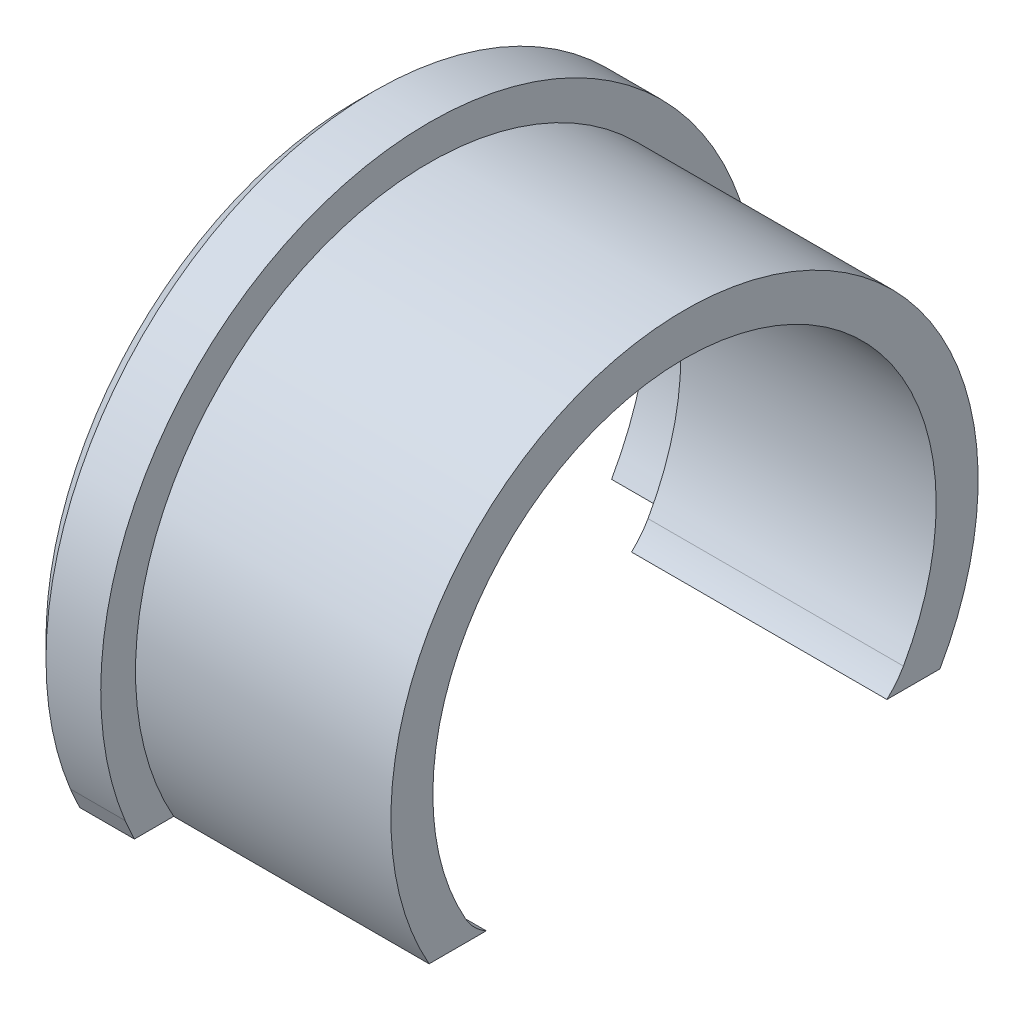
ISO-10303-21;
HEADER;
FILE_DESCRIPTION(('STEP AP214'),'2;1');
FILE_NAME('part.step','',(''),(''),'','','');
FILE_SCHEMA(('AUTOMOTIVE_DESIGN { 1 0 10303 214 1 1 1 1 }'));
ENDSEC;
DATA;
#1=APPLICATION_CONTEXT('core data for automotive mechanical design processes');
#2=APPLICATION_PROTOCOL_DEFINITION('international standard','automotive_design',2000,#1);
#3=PRODUCT_CONTEXT('',#1,'mechanical');
#4=PRODUCT('Part','Part','',(#3));
#5=PRODUCT_RELATED_PRODUCT_CATEGORY('part','',(#4));
#6=PRODUCT_DEFINITION_FORMATION('','',#4);
#7=PRODUCT_DEFINITION_CONTEXT('part definition',#1,'design');
#8=PRODUCT_DEFINITION('design','',#6,#7);
#9=PRODUCT_DEFINITION_SHAPE('','',#8);
#10=(LENGTH_UNIT() NAMED_UNIT(*) SI_UNIT(.MILLI.,.METRE.));
#11=(NAMED_UNIT(*) PLANE_ANGLE_UNIT() SI_UNIT($,.RADIAN.));
#12=(NAMED_UNIT(*) SI_UNIT($,.STERADIAN.) SOLID_ANGLE_UNIT());
#13=UNCERTAINTY_MEASURE_WITH_UNIT(LENGTH_MEASURE(1.E-05),#10,'distance_accuracy_value','');
#14=(GEOMETRIC_REPRESENTATION_CONTEXT(3) GLOBAL_UNCERTAINTY_ASSIGNED_CONTEXT((#13)) GLOBAL_UNIT_ASSIGNED_CONTEXT((#10,
#11,#12)) REPRESENTATION_CONTEXT('',''));
#15=CARTESIAN_POINT('',(0.,0.,0.));
#16=DIRECTION('',(0.,0.,1.));
#17=DIRECTION('',(1.,0.,0.));
#18=AXIS2_PLACEMENT_3D('',#15,#16,#17);
#19=CARTESIAN_POINT('',(7.,-0.567071197410996,-0.56707119741101));
#20=DIRECTION('',(0.,1.,0.));
#21=DIRECTION('',(0.,0.,1.));
#22=AXIS2_PLACEMENT_3D('',#19,#20,#21);
#23=PLANE('',#22);
#24=DIRECTION('',(-1.,0.,0.));
#25=VECTOR('',#24,1.);
#26=CARTESIAN_POINT('',(7.,-0.567071197411,1.00000000000001));
#27=LINE('',#26,#25);
#28=CARTESIAN_POINT('',(7.,-0.567071197411,1.00000000000001));
#29=VERTEX_POINT('',#28);
#30=CARTESIAN_POINT('',(0.,-0.567071197411,1.00000000000001));
#31=VERTEX_POINT('',#30);
#32=EDGE_CURVE('E135',#29,#31,#27,.T.);
#33=ORIENTED_EDGE('',*,*,#32,.T.);
#34=DIRECTION('',(0.,0.,1.));
#35=VECTOR('',#34,1.);
#36=CARTESIAN_POINT('',(0.,-0.567071197410996,-0.56707119741101));
#37=LINE('',#36,#35);
#38=CARTESIAN_POINT('',(0.,-0.567071197410996,-0.56707119741101));
#39=VERTEX_POINT('',#38);
#40=EDGE_CURVE('E12',#39,#31,#37,.T.);
#41=ORIENTED_EDGE('',*,*,#40,.F.);
#42=DIRECTION('',(-1.,0.,0.));
#43=VECTOR('',#42,1.);
#44=CARTESIAN_POINT('',(7.,-0.567071197410996,-0.56707119741101));
#45=LINE('',#44,#43);
#46=CARTESIAN_POINT('',(7.,-0.567071197410996,-0.56707119741101));
#47=VERTEX_POINT('',#46);
#48=EDGE_CURVE('E127',#47,#39,#45,.T.);
#49=ORIENTED_EDGE('',*,*,#48,.F.);
#50=DIRECTION('',(0.,0.,-1.));
#51=VECTOR('',#50,1.);
#52=CARTESIAN_POINT('',(7.,-0.567071197410996,-0.56707119741101));
#53=LINE('',#52,#51);
#54=EDGE_CURVE('E59',#29,#47,#53,.T.);
#55=ORIENTED_EDGE('',*,*,#54,.F.);
#56=EDGE_LOOP('',(#33,#41,#49,#55));
#57=FACE_BOUND('',#56,.T.);
#58=ADVANCED_FACE('F49',(#57),#23,.F.);
#59=CARTESIAN_POINT('',(7.,0.742777429013932,-1.30984862642491));
#60=DIRECTION('',(-1.,0.,0.));
#61=DIRECTION('',(0.,0.,1.));
#62=AXIS2_PLACEMENT_3D('',#59,#60,#61);
#63=CYLINDRICAL_SURFACE('',#62,1.50579604634883);
#64=CARTESIAN_POINT('',(0.,0.742777429013932,-1.30984862642491));
#65=DIRECTION('',(-1.,0.,0.));
#66=DIRECTION('',(0.,0.,-1.));
#67=AXIS2_PLACEMENT_3D('',#64,#65,#66);
#68=CIRCLE('',#67,1.50579604634883);
#69=CARTESIAN_POINT('',(0.,0.,0.));
#70=VERTEX_POINT('',#69);
#71=EDGE_CURVE('E124',#39,#70,#68,.T.);
#72=ORIENTED_EDGE('',*,*,#71,.T.);
#73=DIRECTION('',(-1.,0.,0.));
#74=VECTOR('',#73,1.);
#75=CARTESIAN_POINT('',(7.,0.,0.));
#76=LINE('',#75,#74);
#77=CARTESIAN_POINT('',(7.,0.,0.));
#78=VERTEX_POINT('',#77);
#79=EDGE_CURVE('E108',#78,#70,#76,.T.);
#80=ORIENTED_EDGE('',*,*,#79,.F.);
#81=CARTESIAN_POINT('',(7.,0.742777429013932,-1.30984862642491));
#82=DIRECTION('',(-1.,0.,0.));
#83=DIRECTION('',(0.,0.,-1.));
#84=AXIS2_PLACEMENT_3D('',#81,#82,#83);
#85=CIRCLE('',#84,1.50579604634883);
#86=EDGE_CURVE('E114',#47,#78,#85,.T.);
#87=ORIENTED_EDGE('',*,*,#86,.F.);
#88=ORIENTED_EDGE('',*,*,#48,.T.);
#89=EDGE_LOOP('',(#72,#80,#87,#88));
#90=FACE_BOUND('',#89,.T.);
#91=ADVANCED_FACE('F123',(#90),#63,.F.);
#92=CARTESIAN_POINT('',(7.,3.40242718446602,-6.));
#93=DIRECTION('',(-1.,0.,0.));
#94=DIRECTION('',(0.,0.,1.));
#95=AXIS2_PLACEMENT_3D('',#92,#93,#94);
#96=CYLINDRICAL_SURFACE('',#95,6.89757281553398);
#97=CARTESIAN_POINT('',(0.,3.40242718446602,-6.));
#98=DIRECTION('',(-1.,0.,0.));
#99=DIRECTION('',(0.,0.,1.));
#100=AXIS2_PLACEMENT_3D('',#97,#98,#99);
#101=CIRCLE('',#100,6.89757281553398);
#102=CARTESIAN_POINT('',(0.,0.,-12.));
#103=VERTEX_POINT('',#102);
#104=EDGE_CURVE('E53',#70,#103,#101,.T.);
#105=ORIENTED_EDGE('',*,*,#104,.T.);
#106=DIRECTION('',(-1.,0.,0.));
#107=VECTOR('',#106,1.);
#108=CARTESIAN_POINT('',(7.,0.,-12.));
#109=LINE('',#108,#107);
#110=CARTESIAN_POINT('',(7.,0.,-12.));
#111=VERTEX_POINT('',#110);
#112=EDGE_CURVE('E111',#111,#103,#109,.T.);
#113=ORIENTED_EDGE('',*,*,#112,.F.);
#114=CARTESIAN_POINT('',(7.,3.40242718446602,-6.));
#115=DIRECTION('',(-1.,0.,0.));
#116=DIRECTION('',(0.,0.,1.));
#117=AXIS2_PLACEMENT_3D('',#114,#115,#116);
#118=CIRCLE('',#117,6.89757281553398);
#119=EDGE_CURVE('E103',#78,#111,#118,.T.);
#120=ORIENTED_EDGE('',*,*,#119,.F.);
#121=ORIENTED_EDGE('',*,*,#79,.T.);
#122=EDGE_LOOP('',(#105,#113,#120,#121));
#123=FACE_BOUND('',#122,.T.);
#124=ADVANCED_FACE('F106',(#123),#96,.F.);
#125=CARTESIAN_POINT('',(7.,1.14073875175323,-9.98836767418035));
#126=DIRECTION('',(-1.,0.,0.));
#127=DIRECTION('',(0.,0.,1.));
#128=AXIS2_PLACEMENT_3D('',#125,#126,#127);
#129=CYLINDRICAL_SURFACE('',#128,2.3125634075705);
#130=CARTESIAN_POINT('',(0.,1.14073875175323,-9.98836767418035));
#131=DIRECTION('',(-1.,0.,0.));
#132=DIRECTION('',(0.,0.,1.));
#133=AXIS2_PLACEMENT_3D('',#130,#131,#132);
#134=CIRCLE('',#133,2.3125634075705);
#135=CARTESIAN_POINT('',(0.,-0.567071197411006,-11.5476414447446));
#136=VERTEX_POINT('',#135);
#137=EDGE_CURVE('E125',#103,#136,#134,.T.);
#138=ORIENTED_EDGE('',*,*,#137,.T.);
#139=DIRECTION('',(-1.,0.,0.));
#140=VECTOR('',#139,1.);
#141=CARTESIAN_POINT('',(7.,-0.567071197411006,-11.5476414447446));
#142=LINE('',#141,#140);
#143=CARTESIAN_POINT('',(7.,-0.567071197411006,-11.5476414447446));
#144=VERTEX_POINT('',#143);
#145=EDGE_CURVE('E130',#144,#136,#142,.T.);
#146=ORIENTED_EDGE('',*,*,#145,.F.);
#147=CARTESIAN_POINT('',(7.,1.14073875175323,-9.98836767418035));
#148=DIRECTION('',(-1.,0.,0.));
#149=DIRECTION('',(0.,0.,1.));
#150=AXIS2_PLACEMENT_3D('',#147,#148,#149);
#151=CIRCLE('',#150,2.3125634075705);
#152=EDGE_CURVE('E113',#111,#144,#151,.T.);
#153=ORIENTED_EDGE('',*,*,#152,.F.);
#154=ORIENTED_EDGE('',*,*,#112,.T.);
#155=EDGE_LOOP('',(#138,#146,#153,#154));
#156=FACE_BOUND('',#155,.T.);
#157=ADVANCED_FACE('F170',(#156),#129,.F.);
#158=CARTESIAN_POINT('',(7.,3.40242718446602,-6.));
#159=DIRECTION('',(-1.,0.,0.));
#160=DIRECTION('',(0.,0.,1.));
#161=AXIS2_PLACEMENT_3D('',#158,#159,#160);
#162=CYLINDRICAL_SURFACE('',#161,8.04716828478965);
#163=CARTESIAN_POINT('',(0.,3.40242718446602,-6.));
#164=DIRECTION('',(1.,0.,0.));
#165=DIRECTION('',(0.,0.,1.));
#166=AXIS2_PLACEMENT_3D('',#163,#164,#165);
#167=CIRCLE('',#166,8.04716828478965);
#168=CARTESIAN_POINT('',(0.,-0.567071197411007,-13.));
#169=VERTEX_POINT('',#168);
#170=EDGE_CURVE('E82',#169,#31,#167,.T.);
#171=ORIENTED_EDGE('',*,*,#170,.T.);
#172=ORIENTED_EDGE('',*,*,#32,.F.);
#173=CARTESIAN_POINT('',(7.,3.40242718446602,-6.));
#174=DIRECTION('',(1.,0.,0.));
#175=DIRECTION('',(0.,0.,1.));
#176=AXIS2_PLACEMENT_3D('',#173,#174,#175);
#177=CIRCLE('',#176,8.04716828478965);
#178=CARTESIAN_POINT('',(7.,-0.567071197411007,-13.));
#179=VERTEX_POINT('',#178);
#180=EDGE_CURVE('E140',#179,#29,#177,.T.);
#181=ORIENTED_EDGE('',*,*,#180,.F.);
#182=DIRECTION('',(-1.,0.,0.));
#183=VECTOR('',#182,1.);
#184=CARTESIAN_POINT('',(7.,-0.567071197411007,-13.));
#185=LINE('',#184,#183);
#186=EDGE_CURVE('E133',#179,#169,#185,.T.);
#187=ORIENTED_EDGE('',*,*,#186,.T.);
#188=EDGE_LOOP('',(#171,#172,#181,#187));
#189=FACE_BOUND('',#188,.T.);
#190=ADVANCED_FACE('F149',(#189),#162,.T.);
#191=ORIENTED_EDGE('',*,*,#145,.T.);
#192=DIRECTION('',(0.,0.,-1.));
#193=VECTOR('',#192,1.);
#194=CARTESIAN_POINT('',(0.,-0.567071197411007,-11.5476414447446));
#195=LINE('',#194,#193);
#196=EDGE_CURVE('E78',#136,#169,#195,.T.);
#197=ORIENTED_EDGE('',*,*,#196,.T.);
#198=ORIENTED_EDGE('',*,*,#186,.F.);
#199=DIRECTION('',(0.,0.,-1.));
#200=VECTOR('',#199,1.);
#201=CARTESIAN_POINT('',(7.,-0.567071197411007,-11.5476414447446));
#202=LINE('',#201,#200);
#203=EDGE_CURVE('E142',#144,#179,#202,.T.);
#204=ORIENTED_EDGE('',*,*,#203,.F.);
#205=EDGE_LOOP('',(#191,#197,#198,#204));
#206=FACE_BOUND('',#205,.T.);
#207=ADVANCED_FACE('F51',(#206),#23,.F.);
#208=CARTESIAN_POINT('',(7.,0.742777429013932,-1.30984862642491));
#209=DIRECTION('',(1.,0.,0.));
#210=DIRECTION('',(0.,0.,-1.));
#211=AXIS2_PLACEMENT_3D('',#208,#209,#210);
#212=PLANE('',#211);
#213=ORIENTED_EDGE('',*,*,#86,.T.);
#214=ORIENTED_EDGE('',*,*,#119,.T.);
#215=ORIENTED_EDGE('',*,*,#152,.T.);
#216=ORIENTED_EDGE('',*,*,#203,.T.);
#217=ORIENTED_EDGE('',*,*,#180,.T.);
#218=ORIENTED_EDGE('',*,*,#54,.T.);
#219=EDGE_LOOP('',(#213,#214,#215,#216,#217,#218));
#220=FACE_BOUND('',#219,.T.);
#221=ADVANCED_FACE('F117',(#220),#212,.T.);
#222=CARTESIAN_POINT('',(0.,0.742777429013932,-1.30984862642491));
#223=DIRECTION('',(1.,0.,0.));
#224=DIRECTION('',(0.,0.,-1.));
#225=AXIS2_PLACEMENT_3D('',#222,#223,#224);
#226=PLANE('',#225);
#227=ORIENTED_EDGE('',*,*,#71,.F.);
#228=ORIENTED_EDGE('',*,*,#40,.T.);
#229=ORIENTED_EDGE('',*,*,#170,.F.);
#230=ORIENTED_EDGE('',*,*,#196,.F.);
#231=ORIENTED_EDGE('',*,*,#137,.F.);
#232=ORIENTED_EDGE('',*,*,#104,.F.);
#233=EDGE_LOOP('',(#227,#228,#229,#230,#231,#232));
#234=FACE_BOUND('',#233,.T.);
#235=ADVANCED_FACE('F154',(#234),#226,.F.);
#236=CLOSED_SHELL('',(#58,#91,#124,#157,#190,#207,#221,#235));
#237=MANIFOLD_SOLID_BREP('B2',#236);
#238=CARTESIAN_POINT('',(-2.,0.,-14.3320759270668));
#239=DIRECTION('',(0.,0.409795897842805,0.912177242706268));
#240=DIRECTION('',(0.,-0.912177242706268,0.409795897842805));
#241=AXIS2_PLACEMENT_3D('',#238,#239,#240);
#242=PLANE('',#241);
#243=DIRECTION('',(1.,0.,0.));
#244=VECTOR('',#243,1.);
#245=CARTESIAN_POINT('',(-2.,-0.567071197410992,-14.0773190228117));
#246=LINE('',#245,#244);
#247=CARTESIAN_POINT('',(-1.5,-0.567071197410992,-14.0773190228117));
#248=VERTEX_POINT('',#247);
#249=CARTESIAN_POINT('',(0.,-0.567071197410992,-14.0773190228117));
#250=VERTEX_POINT('',#249);
#251=EDGE_CURVE('E350',#248,#250,#246,.T.);
#252=ORIENTED_EDGE('',*,*,#251,.F.);
#253=CARTESIAN_POINT('',(-1.5,-0.567071197410992,-14.0773190228117));
#254=CARTESIAN_POINT('',(-1.50357950128393,-0.472559331175827,-14.1197785068542));
#255=CARTESIAN_POINT('',(-1.50536925192589,-0.378047464940661,-14.1622379908967));
#256=CARTESIAN_POINT('',(-1.50536925192589,-0.18902373247033,-14.2471569589818));
#257=CARTESIAN_POINT('',(-1.50357950128393,-0.0945118662351652,-14.2896164430243));
#258=CARTESIAN_POINT('',(-1.5,0.,-14.3320759270668));
#259=B_SPLINE_CURVE_WITH_KNOTS('',3,(#253,#254,#255,#256,#257,#258),.UNSPECIFIED.,.F.,.F.,(4,2,
4),(0.,0.310880257761639,0.621760515523277),.UNSPECIFIED.);
#260=CARTESIAN_POINT('',(-1.5,0.,-14.3320759270668));
#261=VERTEX_POINT('',#260);
#262=EDGE_CURVE('E47',#248,#261,#259,.T.);
#263=ORIENTED_EDGE('',*,*,#262,.T.);
#264=DIRECTION('',(1.,0.,0.));
#265=VECTOR('',#264,1.);
#266=CARTESIAN_POINT('',(-2.,0.,-14.3320759270668));
#267=LINE('',#266,#265);
#268=CARTESIAN_POINT('',(0.,0.,-14.3320759270668));
#269=VERTEX_POINT('',#268);
#270=EDGE_CURVE('E316',#261,#269,#267,.T.);
#271=ORIENTED_EDGE('',*,*,#270,.T.);
#272=DIRECTION('',(0.,-0.912177242706268,0.409795897842805));
#273=VECTOR('',#272,1.);
#274=CARTESIAN_POINT('',(0.,0.,-14.3320759270668));
#275=LINE('',#274,#273);
#276=EDGE_CURVE('E331',#269,#250,#275,.T.);
#277=ORIENTED_EDGE('',*,*,#276,.T.);
#278=EDGE_LOOP('',(#252,#263,#271,#277));
#279=FACE_BOUND('',#278,.T.);
#280=ADVANCED_FACE('F248',(#279),#242,.F.);
#281=CARTESIAN_POINT('',(-2.,3.40242718446602,-6.));
#282=DIRECTION('',(1.,0.,0.));
#283=DIRECTION('',(0.,0.,-1.));
#284=AXIS2_PLACEMENT_3D('',#281,#282,#283);
#285=CYLINDRICAL_SURFACE('',#284,9.);
#286=ORIENTED_EDGE('',*,*,#270,.F.);
#287=CARTESIAN_POINT('',(-1.5,3.40242718446602,-6.));
#288=DIRECTION('',(1.,0.,0.));
#289=DIRECTION('',(0.,0.,-1.));
#290=AXIS2_PLACEMENT_3D('',#287,#288,#289);
#291=CIRCLE('',#290,9.);
#292=CARTESIAN_POINT('',(-1.5,0.,2.33207592706684));
#293=VERTEX_POINT('',#292);
#294=EDGE_CURVE('E354',#261,#293,#291,.T.);
#295=ORIENTED_EDGE('',*,*,#294,.T.);
#296=DIRECTION('',(1.,0.,0.));
#297=VECTOR('',#296,1.);
#298=CARTESIAN_POINT('',(-2.,0.,2.33207592706684));
#299=LINE('',#298,#297);
#300=CARTESIAN_POINT('',(0.,0.,2.33207592706684));
#301=VERTEX_POINT('',#300);
#302=EDGE_CURVE('E346',#293,#301,#299,.T.);
#303=ORIENTED_EDGE('',*,*,#302,.T.);
#304=CARTESIAN_POINT('',(0.,3.40242718446602,-6.));
#305=DIRECTION('',(1.,0.,0.));
#306=DIRECTION('',(0.,0.,-1.));
#307=AXIS2_PLACEMENT_3D('',#304,#305,#306);
#308=CIRCLE('',#307,9.);
#309=EDGE_CURVE('E342',#269,#301,#308,.T.);
#310=ORIENTED_EDGE('',*,*,#309,.F.);
#311=EDGE_LOOP('',(#286,#295,#303,#310));
#312=FACE_BOUND('',#311,.T.);
#313=ADVANCED_FACE('F375',(#312),#285,.T.);
#314=CARTESIAN_POINT('',(-2.,0.,2.33207592706683));
#315=DIRECTION('',(0.,-0.409795897842802,0.912177242706269));
#316=DIRECTION('',(0.,-0.912177242706269,-0.409795897842802));
#317=AXIS2_PLACEMENT_3D('',#314,#315,#316);
#318=PLANE('',#317);
#319=ORIENTED_EDGE('',*,*,#302,.F.);
#320=CARTESIAN_POINT('',(-1.5,0.,2.33207592706684));
#321=CARTESIAN_POINT('',(-1.50357950128393,-0.0945118662351571,2.28961644302431));
#322=CARTESIAN_POINT('',(-1.50536925192589,-0.189023732470325,2.24715695898179));
#323=CARTESIAN_POINT('',(-1.50536925192589,-0.378047464940661,2.16223799089674));
#324=CARTESIAN_POINT('',(-1.50357950128392,-0.472559331175828,2.11977850685422));
#325=CARTESIAN_POINT('',(-1.5,-0.567071197410996,2.0773190228117));
#326=B_SPLINE_CURVE_WITH_KNOTS('',3,(#320,#321,#322,#323,#324,#325),.UNSPECIFIED.,.F.,.F.,(4,2,
4),(0.,0.310880257761646,0.621760515523291),.UNSPECIFIED.);
#327=CARTESIAN_POINT('',(-1.5,-0.567071197410996,2.0773190228117));
#328=VERTEX_POINT('',#327);
#329=EDGE_CURVE('E357',#293,#328,#326,.T.);
#330=ORIENTED_EDGE('',*,*,#329,.T.);
#331=DIRECTION('',(1.,0.,0.));
#332=VECTOR('',#331,1.);
#333=CARTESIAN_POINT('',(-2.,-0.567071197410996,2.0773190228117));
#334=LINE('',#333,#332);
#335=CARTESIAN_POINT('',(0.,-0.567071197410996,2.0773190228117));
#336=VERTEX_POINT('',#335);
#337=EDGE_CURVE('E348',#328,#336,#334,.T.);
#338=ORIENTED_EDGE('',*,*,#337,.T.);
#339=DIRECTION('',(0.,-0.912177242706269,-0.409795897842802));
#340=VECTOR('',#339,1.);
#341=CARTESIAN_POINT('',(0.,0.,2.33207592706683));
#342=LINE('',#341,#340);
#343=EDGE_CURVE('E339',#301,#336,#342,.T.);
#344=ORIENTED_EDGE('',*,*,#343,.F.);
#345=EDGE_LOOP('',(#319,#330,#338,#344));
#346=FACE_BOUND('',#345,.T.);
#347=ADVANCED_FACE('F370',(#346),#318,.T.);
#348=CARTESIAN_POINT('',(0.,3.40242718446602,-6.));
#349=DIRECTION('',(1.,0.,0.));
#350=DIRECTION('',(0.,0.,-1.));
#351=AXIS2_PLACEMENT_3D('',#348,#349,#350);
#352=PLANE('',#351);
#353=CARTESIAN_POINT('',(0.,3.40242718446602,-6.));
#354=DIRECTION('',(1.,0.,0.));
#355=DIRECTION('',(0.,0.,1.));
#356=AXIS2_PLACEMENT_3D('',#353,#354,#355);
#357=CIRCLE('',#356,8.04716828478965);
#358=CARTESIAN_POINT('',(0.,-0.567071197411007,-13.));
#359=VERTEX_POINT('',#358);
#360=CARTESIAN_POINT('',(0.,-0.567071197411,1.00000000000001));
#361=VERTEX_POINT('',#360);
#362=EDGE_CURVE('E352',#359,#361,#357,.T.);
#363=ORIENTED_EDGE('',*,*,#362,.F.);
#364=DIRECTION('',(0.,0.,-1.));
#365=VECTOR('',#364,1.);
#366=CARTESIAN_POINT('',(0.,-0.567071197410996,2.0773190228117));
#367=LINE('',#366,#365);
#368=EDGE_CURVE('E329',#359,#250,#367,.T.);
#369=ORIENTED_EDGE('',*,*,#368,.T.);
#370=ORIENTED_EDGE('',*,*,#276,.F.);
#371=ORIENTED_EDGE('',*,*,#309,.T.);
#372=ORIENTED_EDGE('',*,*,#343,.T.);
#373=EDGE_CURVE('E336',#336,#361,#367,.T.);
#374=ORIENTED_EDGE('',*,*,#373,.T.);
#375=EDGE_LOOP('',(#363,#369,#370,#371,#372,#374));
#376=FACE_BOUND('',#375,.T.);
#377=ADVANCED_FACE('F374',(#376),#352,.T.);
#378=CARTESIAN_POINT('',(-2.,3.40242718446602,-6.));
#379=DIRECTION('',(1.,0.,0.));
#380=DIRECTION('',(0.,0.,-1.));
#381=AXIS2_PLACEMENT_3D('',#378,#379,#380);
#382=PLANE('',#381);
#383=DIRECTION('',(0.,0.,1.));
#384=VECTOR('',#383,1.);
#385=CARTESIAN_POINT('',(-2.,-0.567071197410992,-14.0773190228117));
#386=LINE('',#385,#384);
#387=CARTESIAN_POINT('',(-2.,-0.56707119741119,0.999999999999899));
#388=VERTEX_POINT('',#387);
#389=CARTESIAN_POINT('',(-2.,-0.567071197411196,1.51618803625043));
#390=VERTEX_POINT('',#389);
#391=EDGE_CURVE('E317',#388,#390,#386,.T.);
#392=ORIENTED_EDGE('',*,*,#391,.T.);
#393=CARTESIAN_POINT('',(-2.,3.40242718446602,-6.));
#394=DIRECTION('',(1.,0.,0.));
#395=DIRECTION('',(0.,0.,-1.));
#396=AXIS2_PLACEMENT_3D('',#393,#394,#395);
#397=CIRCLE('',#396,8.5);
#398=CARTESIAN_POINT('',(-2.,-0.567071197411,-13.5161880362505));
#399=VERTEX_POINT('',#398);
#400=EDGE_CURVE('E276',#390,#399,#397,.F.);
#401=ORIENTED_EDGE('',*,*,#400,.T.);
#402=CARTESIAN_POINT('',(-2.,-0.567071197411007,-13.));
#403=VERTEX_POINT('',#402);
#404=EDGE_CURVE('E310',#399,#403,#386,.T.);
#405=ORIENTED_EDGE('',*,*,#404,.T.);
#406=CARTESIAN_POINT('',(-2.,3.40242718446602,-6.));
#407=DIRECTION('',(-1.,0.,0.));
#408=DIRECTION('',(0.,0.,1.));
#409=AXIS2_PLACEMENT_3D('',#406,#407,#408);
#410=CIRCLE('',#409,8.04716828478965);
#411=EDGE_CURVE('E313',#388,#403,#410,.T.);
#412=ORIENTED_EDGE('',*,*,#411,.F.);
#413=EDGE_LOOP('',(#392,#401,#405,#412));
#414=FACE_BOUND('',#413,.T.);
#415=ADVANCED_FACE('F312',(#414),#382,.F.);
#416=CARTESIAN_POINT('',(7.,-0.567071197410996,-0.56707119741101));
#417=DIRECTION('',(0.,1.,0.));
#418=DIRECTION('',(0.,0.,1.));
#419=AXIS2_PLACEMENT_3D('',#416,#417,#418);
#420=PLANE('',#419);
#421=ORIENTED_EDGE('',*,*,#404,.F.);
#422=CARTESIAN_POINT('',(-2.,-0.567071197411,-13.5161880362505));
#423=CARTESIAN_POINT('',(-1.91701102768158,-0.567071197410998,-13.6100167290758));
#424=CARTESIAN_POINT('',(-1.83384987080323,-0.567071197410997,-13.7036919955496));
#425=CARTESIAN_POINT('',(-1.66718320406985,-0.567071197410995,-13.8907356576772));
#426=CARTESIAN_POINT('',(-1.58367769428153,-0.567071197410995,-13.9841040533905));
#427=CARTESIAN_POINT('',(-1.5,-0.567071197410996,-14.0773190228117));
#428=B_SPLINE_CURVE_WITH_KNOTS('',3,(#422,#423,#424,#425,#426,#427),.UNSPECIFIED.,.F.,.F.,(4,2,
4),(0.,0.375789172356596,0.751578271916111),.UNSPECIFIED.);
#429=EDGE_CURVE('E262',#399,#248,#428,.T.);
#430=ORIENTED_EDGE('',*,*,#429,.T.);
#431=ORIENTED_EDGE('',*,*,#251,.T.);
#432=ORIENTED_EDGE('',*,*,#368,.F.);
#433=DIRECTION('',(1.,0.,0.));
#434=VECTOR('',#433,1.);
#435=CARTESIAN_POINT('',(-2.,-0.567071197411007,-13.));
#436=LINE('',#435,#434);
#437=EDGE_CURVE('E321',#403,#359,#436,.T.);
#438=ORIENTED_EDGE('',*,*,#437,.F.);
#439=EDGE_LOOP('',(#421,#430,#431,#432,#438));
#440=FACE_BOUND('',#439,.T.);
#441=ADVANCED_FACE('F327',(#440),#420,.F.);
#442=ORIENTED_EDGE('',*,*,#337,.F.);
#443=CARTESIAN_POINT('',(-1.5,-0.567071197410996,2.0773190228117));
#444=CARTESIAN_POINT('',(-1.58367769428154,-0.567071197410996,1.98410405339046));
#445=CARTESIAN_POINT('',(-1.66718320406987,-0.567071197410996,1.89073565767715));
#446=CARTESIAN_POINT('',(-1.83384987080326,-0.567071197410996,1.70369199554951));
#447=CARTESIAN_POINT('',(-1.91701102768162,-0.567071197410996,1.61001672907575));
#448=CARTESIAN_POINT('',(-2.00000000000005,-0.567071197410996,1.51618803625048));
#449=B_SPLINE_CURVE_WITH_KNOTS('',3,(#443,#444,#445,#446,#447,#448),.UNSPECIFIED.,.F.,.F.,(4,2,
4),(0.,0.375789099559554,0.75157827191619),.UNSPECIFIED.);
#450=EDGE_CURVE('E364',#328,#390,#449,.T.);
#451=ORIENTED_EDGE('',*,*,#450,.T.);
#452=ORIENTED_EDGE('',*,*,#391,.F.);
#453=DIRECTION('',(1.,0.,0.));
#454=VECTOR('',#453,1.);
#455=CARTESIAN_POINT('',(-2.,-0.567071197411,1.00000000000001));
#456=LINE('',#455,#454);
#457=EDGE_CURVE('E324',#388,#361,#456,.T.);
#458=ORIENTED_EDGE('',*,*,#457,.T.);
#459=ORIENTED_EDGE('',*,*,#373,.F.);
#460=EDGE_LOOP('',(#442,#451,#452,#458,#459));
#461=FACE_BOUND('',#460,.T.);
#462=ADVANCED_FACE('F381',(#461),#420,.F.);
#463=CARTESIAN_POINT('',(-2.,3.40242718446602,-6.));
#464=DIRECTION('',(1.,0.,0.));
#465=DIRECTION('',(0.,0.,-1.));
#466=AXIS2_PLACEMENT_3D('',#463,#464,#465);
#467=CYLINDRICAL_SURFACE('',#466,8.04716828478965);
#468=ORIENTED_EDGE('',*,*,#362,.T.);
#469=ORIENTED_EDGE('',*,*,#457,.F.);
#470=ORIENTED_EDGE('',*,*,#411,.T.);
#471=ORIENTED_EDGE('',*,*,#437,.T.);
#472=EDGE_LOOP('',(#468,#469,#470,#471));
#473=FACE_BOUND('',#472,.T.);
#474=ADVANCED_FACE('F320',(#473),#467,.F.);
#475=CARTESIAN_POINT('',(-1.5,3.40242718446602,-6.));
#476=DIRECTION('',(1.,0.,0.));
#477=DIRECTION('',(0.,0.,-1.));
#478=AXIS2_PLACEMENT_3D('',#475,#476,#477);
#479=CONICAL_SURFACE('',#478,9.,0.785398163397452);
#480=ORIENTED_EDGE('',*,*,#429,.F.);
#481=ORIENTED_EDGE('',*,*,#400,.F.);
#482=ORIENTED_EDGE('',*,*,#450,.F.);
#483=ORIENTED_EDGE('',*,*,#329,.F.);
#484=ORIENTED_EDGE('',*,*,#294,.F.);
#485=ORIENTED_EDGE('',*,*,#262,.F.);
#486=EDGE_LOOP('',(#480,#481,#482,#483,#484,#485));
#487=FACE_BOUND('',#486,.T.);
#488=ADVANCED_FACE('F250',(#487),#479,.T.);
#489=CLOSED_SHELL('',(#280,#313,#347,#377,#415,#441,#462,#474,#488));
#490=MANIFOLD_SOLID_BREP('B6',#489);
#491=ADVANCED_BREP_SHAPE_REPRESENTATION('',(#18,#237,#490),#14);
#492=SHAPE_DEFINITION_REPRESENTATION(#9,#491);
ENDSEC;
END-ISO-10303-21;
